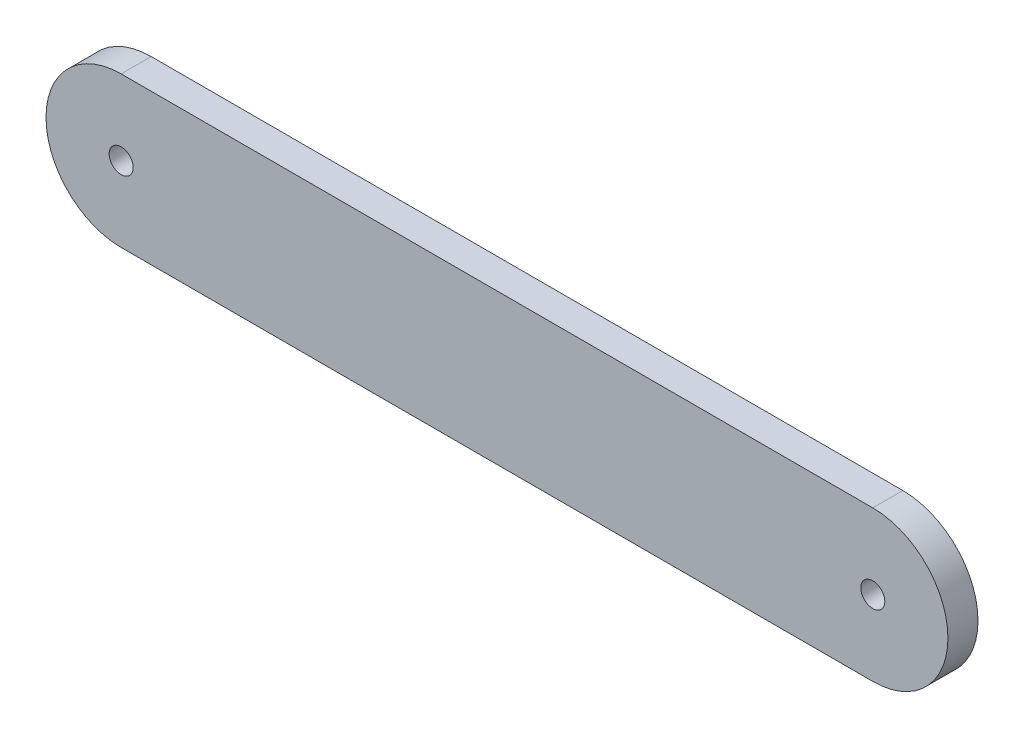
ISO-10303-21;
HEADER;
FILE_DESCRIPTION(('STEP AP214'),'2;1');
FILE_NAME('part.step','',(''),(''),'','','');
FILE_SCHEMA(('AUTOMOTIVE_DESIGN { 1 0 10303 214 1 1 1 1 }'));
ENDSEC;
DATA;
#1=APPLICATION_CONTEXT('core data for automotive mechanical design processes');
#2=APPLICATION_PROTOCOL_DEFINITION('international standard','automotive_design',2000,#1);
#3=PRODUCT_CONTEXT('',#1,'mechanical');
#4=PRODUCT('Part','Part','',(#3));
#5=PRODUCT_RELATED_PRODUCT_CATEGORY('part','',(#4));
#6=PRODUCT_DEFINITION_FORMATION('','',#4);
#7=PRODUCT_DEFINITION_CONTEXT('part definition',#1,'design');
#8=PRODUCT_DEFINITION('design','',#6,#7);
#9=PRODUCT_DEFINITION_SHAPE('','',#8);
#10=(LENGTH_UNIT() NAMED_UNIT(*) SI_UNIT(.MILLI.,.METRE.));
#11=(NAMED_UNIT(*) PLANE_ANGLE_UNIT() SI_UNIT($,.RADIAN.));
#12=(NAMED_UNIT(*) SI_UNIT($,.STERADIAN.) SOLID_ANGLE_UNIT());
#13=UNCERTAINTY_MEASURE_WITH_UNIT(LENGTH_MEASURE(1.E-05),#10,'distance_accuracy_value','');
#14=(GEOMETRIC_REPRESENTATION_CONTEXT(3) GLOBAL_UNCERTAINTY_ASSIGNED_CONTEXT((#13)) GLOBAL_UNIT_ASSIGNED_CONTEXT((#10,
#11,#12)) REPRESENTATION_CONTEXT('',''));
#15=CARTESIAN_POINT('',(0.,0.,0.));
#16=DIRECTION('',(0.,0.,1.));
#17=DIRECTION('',(1.,0.,0.));
#18=AXIS2_PLACEMENT_3D('',#15,#16,#17);
#19=CARTESIAN_POINT('',(0.,0.,4.));
#20=DIRECTION('',(0.,0.,1.));
#21=DIRECTION('',(1.,0.,0.));
#22=AXIS2_PLACEMENT_3D('',#19,#20,#21);
#23=PLANE('',#22);
#24=CARTESIAN_POINT('',(0.,0.,4.));
#25=DIRECTION('',(0.,0.,1.));
#26=DIRECTION('',(1.,0.,0.));
#27=AXIS2_PLACEMENT_3D('',#24,#25,#26);
#28=CIRCLE('',#27,1.6);
#29=CARTESIAN_POINT('',(1.6,0.,4.));
#30=VERTEX_POINT('',#29);
#31=EDGE_CURVE('E100',#30,#30,#28,.T.);
#32=ORIENTED_EDGE('',*,*,#31,.F.);
#33=EDGE_LOOP('',(#32));
#34=FACE_BOUND('',#33,.T.);
#35=CARTESIAN_POINT('',(0.,0.,4.));
#36=DIRECTION('',(0.,0.,1.));
#37=DIRECTION('',(1.,0.,0.));
#38=AXIS2_PLACEMENT_3D('',#35,#36,#37);
#39=CIRCLE('',#38,10.);
#40=CARTESIAN_POINT('',(0.,10.,4.));
#41=VERTEX_POINT('',#40);
#42=CARTESIAN_POINT('',(0.,-10.,4.));
#43=VERTEX_POINT('',#42);
#44=EDGE_CURVE('E85',#41,#43,#39,.T.);
#45=ORIENTED_EDGE('',*,*,#44,.T.);
#46=DIRECTION('',(1.,0.,0.));
#47=VECTOR('',#46,1.);
#48=CARTESIAN_POINT('',(0.,-10.,4.));
#49=LINE('',#48,#47);
#50=CARTESIAN_POINT('',(100.,-10.,4.));
#51=VERTEX_POINT('',#50);
#52=EDGE_CURVE('E80',#43,#51,#49,.T.);
#53=ORIENTED_EDGE('',*,*,#52,.T.);
#54=CARTESIAN_POINT('',(100.,0.,4.));
#55=DIRECTION('',(0.,0.,1.));
#56=DIRECTION('',(1.,0.,0.));
#57=AXIS2_PLACEMENT_3D('',#54,#55,#56);
#58=CIRCLE('',#57,10.);
#59=CARTESIAN_POINT('',(100.,10.,4.));
#60=VERTEX_POINT('',#59);
#61=EDGE_CURVE('E83',#51,#60,#58,.T.);
#62=ORIENTED_EDGE('',*,*,#61,.T.);
#63=DIRECTION('',(-1.,0.,0.));
#64=VECTOR('',#63,1.);
#65=CARTESIAN_POINT('',(0.,10.,4.));
#66=LINE('',#65,#64);
#67=EDGE_CURVE('E50',#60,#41,#66,.T.);
#68=ORIENTED_EDGE('',*,*,#67,.T.);
#69=EDGE_LOOP('',(#45,#53,#62,#68));
#70=FACE_BOUND('',#69,.T.);
#71=CARTESIAN_POINT('',(100.,0.,4.));
#72=DIRECTION('',(0.,0.,1.));
#73=DIRECTION('',(1.,0.,0.));
#74=AXIS2_PLACEMENT_3D('',#71,#72,#73);
#75=CIRCLE('',#74,1.60000000000001);
#76=CARTESIAN_POINT('',(101.6,0.,4.));
#77=VERTEX_POINT('',#76);
#78=EDGE_CURVE('E115',#77,#77,#75,.T.);
#79=ORIENTED_EDGE('',*,*,#78,.F.);
#80=EDGE_LOOP('',(#79));
#81=FACE_BOUND('',#80,.T.);
#82=ADVANCED_FACE('F33',(#34,#70,#81),#23,.T.);
#83=CARTESIAN_POINT('',(0.,0.,0.));
#84=DIRECTION('',(0.,0.,1.));
#85=DIRECTION('',(1.,0.,0.));
#86=AXIS2_PLACEMENT_3D('',#83,#84,#85);
#87=PLANE('',#86);
#88=CARTESIAN_POINT('',(0.,0.,0.));
#89=DIRECTION('',(0.,0.,1.));
#90=DIRECTION('',(1.,0.,0.));
#91=AXIS2_PLACEMENT_3D('',#88,#89,#90);
#92=CIRCLE('',#91,10.);
#93=CARTESIAN_POINT('',(0.,10.,0.));
#94=VERTEX_POINT('',#93);
#95=CARTESIAN_POINT('',(0.,-10.,0.));
#96=VERTEX_POINT('',#95);
#97=EDGE_CURVE('E97',#94,#96,#92,.T.);
#98=ORIENTED_EDGE('',*,*,#97,.F.);
#99=DIRECTION('',(-1.,0.,0.));
#100=VECTOR('',#99,1.);
#101=CARTESIAN_POINT('',(0.,10.,0.));
#102=LINE('',#101,#100);
#103=CARTESIAN_POINT('',(100.,10.,0.));
#104=VERTEX_POINT('',#103);
#105=EDGE_CURVE('E73',#104,#94,#102,.T.);
#106=ORIENTED_EDGE('',*,*,#105,.F.);
#107=CARTESIAN_POINT('',(100.,0.,0.));
#108=DIRECTION('',(0.,0.,1.));
#109=DIRECTION('',(1.,0.,0.));
#110=AXIS2_PLACEMENT_3D('',#107,#108,#109);
#111=CIRCLE('',#110,10.);
#112=CARTESIAN_POINT('',(100.,-10.,0.));
#113=VERTEX_POINT('',#112);
#114=EDGE_CURVE('E67',#113,#104,#111,.T.);
#115=ORIENTED_EDGE('',*,*,#114,.F.);
#116=DIRECTION('',(1.,0.,0.));
#117=VECTOR('',#116,1.);
#118=CARTESIAN_POINT('',(0.,-10.,0.));
#119=LINE('',#118,#117);
#120=EDGE_CURVE('E89',#96,#113,#119,.T.);
#121=ORIENTED_EDGE('',*,*,#120,.F.);
#122=EDGE_LOOP('',(#98,#106,#115,#121));
#123=FACE_BOUND('',#122,.T.);
#124=CARTESIAN_POINT('',(0.,0.,0.));
#125=DIRECTION('',(0.,0.,1.));
#126=DIRECTION('',(1.,0.,0.));
#127=AXIS2_PLACEMENT_3D('',#124,#125,#126);
#128=CIRCLE('',#127,1.6);
#129=CARTESIAN_POINT('',(1.6,0.,0.));
#130=VERTEX_POINT('',#129);
#131=EDGE_CURVE('E112',#130,#130,#128,.T.);
#132=ORIENTED_EDGE('',*,*,#131,.T.);
#133=EDGE_LOOP('',(#132));
#134=FACE_BOUND('',#133,.T.);
#135=CARTESIAN_POINT('',(100.,0.,0.));
#136=DIRECTION('',(0.,0.,1.));
#137=DIRECTION('',(1.,0.,0.));
#138=AXIS2_PLACEMENT_3D('',#135,#136,#137);
#139=CIRCLE('',#138,1.60000000000001);
#140=CARTESIAN_POINT('',(101.6,0.,0.));
#141=VERTEX_POINT('',#140);
#142=EDGE_CURVE('E118',#141,#141,#139,.T.);
#143=ORIENTED_EDGE('',*,*,#142,.T.);
#144=EDGE_LOOP('',(#143));
#145=FACE_BOUND('',#144,.T.);
#146=ADVANCED_FACE('F108',(#123,#134,#145),#87,.F.);
#147=CARTESIAN_POINT('',(0.,0.,4.));
#148=DIRECTION('',(0.,0.,-1.));
#149=DIRECTION('',(-1.,0.,0.));
#150=AXIS2_PLACEMENT_3D('',#147,#148,#149);
#151=CYLINDRICAL_SURFACE('',#150,10.);
#152=ORIENTED_EDGE('',*,*,#97,.T.);
#153=DIRECTION('',(0.,0.,-1.));
#154=VECTOR('',#153,1.);
#155=CARTESIAN_POINT('',(0.,-10.,4.));
#156=LINE('',#155,#154);
#157=EDGE_CURVE('E11',#43,#96,#156,.T.);
#158=ORIENTED_EDGE('',*,*,#157,.F.);
#159=ORIENTED_EDGE('',*,*,#44,.F.);
#160=DIRECTION('',(0.,0.,-1.));
#161=VECTOR('',#160,1.);
#162=CARTESIAN_POINT('',(0.,10.,4.));
#163=LINE('',#162,#161);
#164=EDGE_CURVE('E93',#41,#94,#163,.T.);
#165=ORIENTED_EDGE('',*,*,#164,.T.);
#166=EDGE_LOOP('',(#152,#158,#159,#165));
#167=FACE_BOUND('',#166,.T.);
#168=ADVANCED_FACE('F35',(#167),#151,.T.);
#169=CARTESIAN_POINT('',(0.,-10.,4.));
#170=DIRECTION('',(0.,1.,0.));
#171=DIRECTION('',(0.,0.,1.));
#172=AXIS2_PLACEMENT_3D('',#169,#170,#171);
#173=PLANE('',#172);
#174=ORIENTED_EDGE('',*,*,#120,.T.);
#175=DIRECTION('',(0.,0.,-1.));
#176=VECTOR('',#175,1.);
#177=CARTESIAN_POINT('',(100.,-10.,4.));
#178=LINE('',#177,#176);
#179=EDGE_CURVE('E42',#51,#113,#178,.T.);
#180=ORIENTED_EDGE('',*,*,#179,.F.);
#181=ORIENTED_EDGE('',*,*,#52,.F.);
#182=ORIENTED_EDGE('',*,*,#157,.T.);
#183=EDGE_LOOP('',(#174,#180,#181,#182));
#184=FACE_BOUND('',#183,.T.);
#185=ADVANCED_FACE('F88',(#184),#173,.F.);
#186=CARTESIAN_POINT('',(100.,0.,4.));
#187=DIRECTION('',(0.,0.,-1.));
#188=DIRECTION('',(-1.,0.,0.));
#189=AXIS2_PLACEMENT_3D('',#186,#187,#188);
#190=CYLINDRICAL_SURFACE('',#189,10.);
#191=ORIENTED_EDGE('',*,*,#114,.T.);
#192=DIRECTION('',(0.,0.,-1.));
#193=VECTOR('',#192,1.);
#194=CARTESIAN_POINT('',(100.,10.,4.));
#195=LINE('',#194,#193);
#196=EDGE_CURVE('E90',#60,#104,#195,.T.);
#197=ORIENTED_EDGE('',*,*,#196,.F.);
#198=ORIENTED_EDGE('',*,*,#61,.F.);
#199=ORIENTED_EDGE('',*,*,#179,.T.);
#200=EDGE_LOOP('',(#191,#197,#198,#199));
#201=FACE_BOUND('',#200,.T.);
#202=ADVANCED_FACE('F91',(#201),#190,.T.);
#203=CARTESIAN_POINT('',(0.,10.,4.));
#204=DIRECTION('',(0.,-1.,0.));
#205=DIRECTION('',(0.,0.,-1.));
#206=AXIS2_PLACEMENT_3D('',#203,#204,#205);
#207=PLANE('',#206);
#208=ORIENTED_EDGE('',*,*,#105,.T.);
#209=ORIENTED_EDGE('',*,*,#164,.F.);
#210=ORIENTED_EDGE('',*,*,#67,.F.);
#211=ORIENTED_EDGE('',*,*,#196,.T.);
#212=EDGE_LOOP('',(#208,#209,#210,#211));
#213=FACE_BOUND('',#212,.T.);
#214=ADVANCED_FACE('F105',(#213),#207,.F.);
#215=CARTESIAN_POINT('',(0.,0.,4.));
#216=DIRECTION('',(0.,0.,-1.));
#217=DIRECTION('',(-1.,0.,0.));
#218=AXIS2_PLACEMENT_3D('',#215,#216,#217);
#219=CYLINDRICAL_SURFACE('',#218,1.6);
#220=ORIENTED_EDGE('',*,*,#31,.T.);
#221=EDGE_LOOP('',(#220));
#222=FACE_BOUND('',#221,.T.);
#223=ORIENTED_EDGE('',*,*,#131,.F.);
#224=EDGE_LOOP('',(#223));
#225=FACE_BOUND('',#224,.T.);
#226=ADVANCED_FACE('F135',(#222,#225),#219,.F.);
#227=CARTESIAN_POINT('',(100.,0.,4.));
#228=DIRECTION('',(0.,0.,-1.));
#229=DIRECTION('',(-1.,0.,0.));
#230=AXIS2_PLACEMENT_3D('',#227,#228,#229);
#231=CYLINDRICAL_SURFACE('',#230,1.60000000000001);
#232=ORIENTED_EDGE('',*,*,#78,.T.);
#233=EDGE_LOOP('',(#232));
#234=FACE_BOUND('',#233,.T.);
#235=ORIENTED_EDGE('',*,*,#142,.F.);
#236=EDGE_LOOP('',(#235));
#237=FACE_BOUND('',#236,.T.);
#238=ADVANCED_FACE('F124',(#234,#237),#231,.F.);
#239=CLOSED_SHELL('',(#82,#146,#168,#185,#202,#214,#226,#238));
#240=MANIFOLD_SOLID_BREP('B2',#239);
#241=ADVANCED_BREP_SHAPE_REPRESENTATION('',(#18,#240),#14);
#242=SHAPE_DEFINITION_REPRESENTATION(#9,#241);
ENDSEC;
END-ISO-10303-21;
